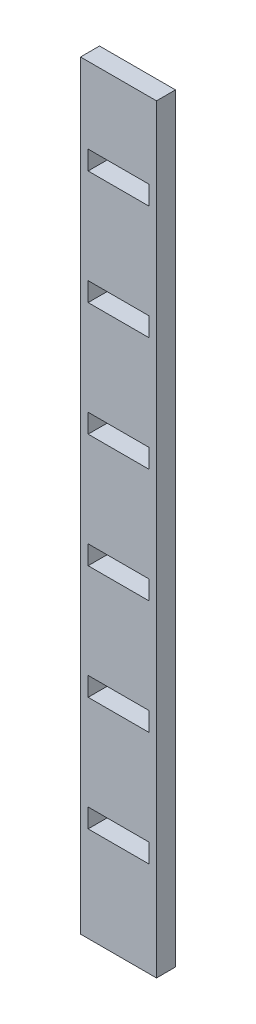
ISO-10303-21;
HEADER;
FILE_DESCRIPTION(('STEP AP214'),'2;1');
FILE_NAME('part.step','',(''),(''),'','','');
FILE_SCHEMA(('AUTOMOTIVE_DESIGN { 1 0 10303 214 1 1 1 1 }'));
ENDSEC;
DATA;
#1=APPLICATION_CONTEXT('core data for automotive mechanical design processes');
#2=APPLICATION_PROTOCOL_DEFINITION('international standard','automotive_design',2000,#1);
#3=PRODUCT_CONTEXT('',#1,'mechanical');
#4=PRODUCT('Part','Part','',(#3));
#5=PRODUCT_RELATED_PRODUCT_CATEGORY('part','',(#4));
#6=PRODUCT_DEFINITION_FORMATION('','',#4);
#7=PRODUCT_DEFINITION_CONTEXT('part definition',#1,'design');
#8=PRODUCT_DEFINITION('design','',#6,#7);
#9=PRODUCT_DEFINITION_SHAPE('','',#8);
#10=(LENGTH_UNIT() NAMED_UNIT(*) SI_UNIT(.MILLI.,.METRE.));
#11=(NAMED_UNIT(*) PLANE_ANGLE_UNIT() SI_UNIT($,.RADIAN.));
#12=(NAMED_UNIT(*) SI_UNIT($,.STERADIAN.) SOLID_ANGLE_UNIT());
#13=UNCERTAINTY_MEASURE_WITH_UNIT(LENGTH_MEASURE(1.E-05),#10,'distance_accuracy_value','');
#14=(GEOMETRIC_REPRESENTATION_CONTEXT(3) GLOBAL_UNCERTAINTY_ASSIGNED_CONTEXT((#13)) GLOBAL_UNIT_ASSIGNED_CONTEXT((#10,
#11,#12)) REPRESENTATION_CONTEXT('',''));
#15=CARTESIAN_POINT('',(0.,0.,0.));
#16=DIRECTION('',(0.,0.,1.));
#17=DIRECTION('',(1.,0.,0.));
#18=AXIS2_PLACEMENT_3D('',#15,#16,#17);
#19=CARTESIAN_POINT('',(0.,0.,50.));
#20=DIRECTION('',(0.,0.,-1.));
#21=DIRECTION('',(-1.,0.,0.));
#22=AXIS2_PLACEMENT_3D('',#19,#20,#21);
#23=PLANE('',#22);
#24=DIRECTION('',(0.,-1.,0.));
#25=VECTOR('',#24,1.);
#26=CARTESIAN_POINT('',(-80.,1450.,50.));
#27=LINE('',#26,#25);
#28=CARTESIAN_POINT('',(-80.,1500.,50.));
#29=VERTEX_POINT('',#28);
#30=CARTESIAN_POINT('',(-80.,1450.,50.));
#31=VERTEX_POINT('',#30);
#32=EDGE_CURVE('E262',#29,#31,#27,.T.);
#33=ORIENTED_EDGE('',*,*,#32,.F.);
#34=DIRECTION('',(-1.,0.,0.));
#35=VECTOR('',#34,1.);
#36=CARTESIAN_POINT('',(-80.,1500.,50.));
#37=LINE('',#36,#35);
#38=CARTESIAN_POINT('',(80.,1500.,50.));
#39=VERTEX_POINT('',#38);
#40=EDGE_CURVE('E270',#39,#29,#37,.T.);
#41=ORIENTED_EDGE('',*,*,#40,.F.);
#42=DIRECTION('',(0.,1.,0.));
#43=VECTOR('',#42,1.);
#44=CARTESIAN_POINT('',(80.,1500.,50.));
#45=LINE('',#44,#43);
#46=CARTESIAN_POINT('',(80.,1450.,50.));
#47=VERTEX_POINT('',#46);
#48=EDGE_CURVE('E267',#47,#39,#45,.T.);
#49=ORIENTED_EDGE('',*,*,#48,.F.);
#50=DIRECTION('',(1.,0.,0.));
#51=VECTOR('',#50,1.);
#52=CARTESIAN_POINT('',(80.,1450.,50.));
#53=LINE('',#52,#51);
#54=EDGE_CURVE('E264',#31,#47,#53,.T.);
#55=ORIENTED_EDGE('',*,*,#54,.F.);
#56=EDGE_LOOP('',(#33,#41,#49,#55));
#57=FACE_BOUND('',#56,.T.);
#58=DIRECTION('',(0.,-1.,0.));
#59=VECTOR('',#58,1.);
#60=CARTESIAN_POINT('',(-80.,850.,50.));
#61=LINE('',#60,#59);
#62=CARTESIAN_POINT('',(-80.,900.,50.));
#63=VERTEX_POINT('',#62);
#64=CARTESIAN_POINT('',(-80.,850.,50.));
#65=VERTEX_POINT('',#64);
#66=EDGE_CURVE('E324',#63,#65,#61,.T.);
#67=ORIENTED_EDGE('',*,*,#66,.F.);
#68=DIRECTION('',(-1.,0.,0.));
#69=VECTOR('',#68,1.);
#70=CARTESIAN_POINT('',(-80.,900.,50.));
#71=LINE('',#70,#69);
#72=CARTESIAN_POINT('',(80.,900.,50.));
#73=VERTEX_POINT('',#72);
#74=EDGE_CURVE('E332',#73,#63,#71,.T.);
#75=ORIENTED_EDGE('',*,*,#74,.F.);
#76=DIRECTION('',(0.,1.,0.));
#77=VECTOR('',#76,1.);
#78=CARTESIAN_POINT('',(80.,900.,50.));
#79=LINE('',#78,#77);
#80=CARTESIAN_POINT('',(80.,850.,50.));
#81=VERTEX_POINT('',#80);
#82=EDGE_CURVE('E329',#81,#73,#79,.T.);
#83=ORIENTED_EDGE('',*,*,#82,.F.);
#84=DIRECTION('',(1.,0.,0.));
#85=VECTOR('',#84,1.);
#86=CARTESIAN_POINT('',(80.,850.,50.));
#87=LINE('',#86,#85);
#88=EDGE_CURVE('E326',#65,#81,#87,.T.);
#89=ORIENTED_EDGE('',*,*,#88,.F.);
#90=EDGE_LOOP('',(#67,#75,#83,#89));
#91=FACE_BOUND('',#90,.T.);
#92=DIRECTION('',(0.,-1.,0.));
#93=VECTOR('',#92,1.);
#94=CARTESIAN_POINT('',(-80.,250.,50.));
#95=LINE('',#94,#93);
#96=CARTESIAN_POINT('',(-80.,300.,50.));
#97=VERTEX_POINT('',#96);
#98=CARTESIAN_POINT('',(-80.,250.,50.));
#99=VERTEX_POINT('',#98);
#100=EDGE_CURVE('E386',#97,#99,#95,.T.);
#101=ORIENTED_EDGE('',*,*,#100,.F.);
#102=DIRECTION('',(-1.,0.,0.));
#103=VECTOR('',#102,1.);
#104=CARTESIAN_POINT('',(-80.,300.,50.));
#105=LINE('',#104,#103);
#106=CARTESIAN_POINT('',(80.,300.,50.));
#107=VERTEX_POINT('',#106);
#108=EDGE_CURVE('E394',#107,#97,#105,.T.);
#109=ORIENTED_EDGE('',*,*,#108,.F.);
#110=DIRECTION('',(0.,1.,0.));
#111=VECTOR('',#110,1.);
#112=CARTESIAN_POINT('',(80.,300.,50.));
#113=LINE('',#112,#111);
#114=CARTESIAN_POINT('',(80.,250.,50.));
#115=VERTEX_POINT('',#114);
#116=EDGE_CURVE('E391',#115,#107,#113,.T.);
#117=ORIENTED_EDGE('',*,*,#116,.F.);
#118=DIRECTION('',(1.,0.,0.));
#119=VECTOR('',#118,1.);
#120=CARTESIAN_POINT('',(80.,250.,50.));
#121=LINE('',#120,#119);
#122=EDGE_CURVE('E388',#99,#115,#121,.T.);
#123=ORIENTED_EDGE('',*,*,#122,.F.);
#124=EDGE_LOOP('',(#101,#109,#117,#123));
#125=FACE_BOUND('',#124,.T.);
#126=DIRECTION('',(1.,0.,0.));
#127=VECTOR('',#126,1.);
#128=CARTESIAN_POINT('',(100.,0.,50.));
#129=LINE('',#128,#127);
#130=CARTESIAN_POINT('',(-100.,0.,50.));
#131=VERTEX_POINT('',#130);
#132=CARTESIAN_POINT('',(100.,0.,50.));
#133=VERTEX_POINT('',#132);
#134=EDGE_CURVE('E417',#131,#133,#129,.T.);
#135=ORIENTED_EDGE('',*,*,#134,.T.);
#136=DIRECTION('',(0.,1.,0.));
#137=VECTOR('',#136,1.);
#138=CARTESIAN_POINT('',(100.,2000.,50.));
#139=LINE('',#138,#137);
#140=CARTESIAN_POINT('',(100.,2000.,50.));
#141=VERTEX_POINT('',#140);
#142=EDGE_CURVE('E420',#133,#141,#139,.T.);
#143=ORIENTED_EDGE('',*,*,#142,.T.);
#144=DIRECTION('',(-1.,0.,0.));
#145=VECTOR('',#144,1.);
#146=CARTESIAN_POINT('',(-100.,2000.,50.));
#147=LINE('',#146,#145);
#148=CARTESIAN_POINT('',(-100.,2000.,50.));
#149=VERTEX_POINT('',#148);
#150=EDGE_CURVE('E423',#141,#149,#147,.T.);
#151=ORIENTED_EDGE('',*,*,#150,.T.);
#152=DIRECTION('',(0.,-1.,0.));
#153=VECTOR('',#152,1.);
#154=CARTESIAN_POINT('',(-100.,0.,50.));
#155=LINE('',#154,#153);
#156=EDGE_CURVE('E425',#149,#131,#155,.T.);
#157=ORIENTED_EDGE('',*,*,#156,.T.);
#158=EDGE_LOOP('',(#135,#143,#151,#157));
#159=FACE_BOUND('',#158,.T.);
#160=DIRECTION('',(0.,-1.,0.));
#161=VECTOR('',#160,1.);
#162=CARTESIAN_POINT('',(-80.,550.,50.));
#163=LINE('',#162,#161);
#164=CARTESIAN_POINT('',(-80.,600.,50.));
#165=VERTEX_POINT('',#164);
#166=CARTESIAN_POINT('',(-80.,550.,50.));
#167=VERTEX_POINT('',#166);
#168=EDGE_CURVE('E355',#165,#167,#163,.T.);
#169=ORIENTED_EDGE('',*,*,#168,.F.);
#170=DIRECTION('',(-1.,0.,0.));
#171=VECTOR('',#170,1.);
#172=CARTESIAN_POINT('',(-80.,600.,50.));
#173=LINE('',#172,#171);
#174=CARTESIAN_POINT('',(80.,600.,50.));
#175=VERTEX_POINT('',#174);
#176=EDGE_CURVE('E363',#175,#165,#173,.T.);
#177=ORIENTED_EDGE('',*,*,#176,.F.);
#178=DIRECTION('',(0.,1.,0.));
#179=VECTOR('',#178,1.);
#180=CARTESIAN_POINT('',(80.,600.,50.));
#181=LINE('',#180,#179);
#182=CARTESIAN_POINT('',(80.,550.,50.));
#183=VERTEX_POINT('',#182);
#184=EDGE_CURVE('E360',#183,#175,#181,.T.);
#185=ORIENTED_EDGE('',*,*,#184,.F.);
#186=DIRECTION('',(1.,0.,0.));
#187=VECTOR('',#186,1.);
#188=CARTESIAN_POINT('',(80.,550.,50.));
#189=LINE('',#188,#187);
#190=EDGE_CURVE('E357',#167,#183,#189,.T.);
#191=ORIENTED_EDGE('',*,*,#190,.F.);
#192=EDGE_LOOP('',(#169,#177,#185,#191));
#193=FACE_BOUND('',#192,.T.);
#194=DIRECTION('',(0.,-1.,0.));
#195=VECTOR('',#194,1.);
#196=CARTESIAN_POINT('',(-80.,1150.,50.));
#197=LINE('',#196,#195);
#198=CARTESIAN_POINT('',(-80.,1200.,50.));
#199=VERTEX_POINT('',#198);
#200=CARTESIAN_POINT('',(-80.,1150.,50.));
#201=VERTEX_POINT('',#200);
#202=EDGE_CURVE('E293',#199,#201,#197,.T.);
#203=ORIENTED_EDGE('',*,*,#202,.F.);
#204=DIRECTION('',(-1.,0.,0.));
#205=VECTOR('',#204,1.);
#206=CARTESIAN_POINT('',(-80.,1200.,50.));
#207=LINE('',#206,#205);
#208=CARTESIAN_POINT('',(80.,1200.,50.));
#209=VERTEX_POINT('',#208);
#210=EDGE_CURVE('E301',#209,#199,#207,.T.);
#211=ORIENTED_EDGE('',*,*,#210,.F.);
#212=DIRECTION('',(0.,1.,0.));
#213=VECTOR('',#212,1.);
#214=CARTESIAN_POINT('',(80.,1200.,50.));
#215=LINE('',#214,#213);
#216=CARTESIAN_POINT('',(80.,1150.,50.));
#217=VERTEX_POINT('',#216);
#218=EDGE_CURVE('E298',#217,#209,#215,.T.);
#219=ORIENTED_EDGE('',*,*,#218,.F.);
#220=DIRECTION('',(1.,0.,0.));
#221=VECTOR('',#220,1.);
#222=CARTESIAN_POINT('',(80.,1150.,50.));
#223=LINE('',#222,#221);
#224=EDGE_CURVE('E295',#201,#217,#223,.T.);
#225=ORIENTED_EDGE('',*,*,#224,.F.);
#226=EDGE_LOOP('',(#203,#211,#219,#225));
#227=FACE_BOUND('',#226,.T.);
#228=DIRECTION('',(0.,-1.,0.));
#229=VECTOR('',#228,1.);
#230=CARTESIAN_POINT('',(-80.,1750.,50.));
#231=LINE('',#230,#229);
#232=CARTESIAN_POINT('',(-80.,1800.,50.));
#233=VERTEX_POINT('',#232);
#234=CARTESIAN_POINT('',(-80.,1750.,50.));
#235=VERTEX_POINT('',#234);
#236=EDGE_CURVE('E226',#233,#235,#231,.T.);
#237=ORIENTED_EDGE('',*,*,#236,.F.);
#238=DIRECTION('',(-1.,0.,0.));
#239=VECTOR('',#238,1.);
#240=CARTESIAN_POINT('',(-80.,1800.,50.));
#241=LINE('',#240,#239);
#242=CARTESIAN_POINT('',(80.,1800.,50.));
#243=VERTEX_POINT('',#242);
#244=EDGE_CURVE('E248',#243,#233,#241,.T.);
#245=ORIENTED_EDGE('',*,*,#244,.F.);
#246=DIRECTION('',(0.,1.,0.));
#247=VECTOR('',#246,1.);
#248=CARTESIAN_POINT('',(80.,1800.,50.));
#249=LINE('',#248,#247);
#250=CARTESIAN_POINT('',(80.,1750.,50.));
#251=VERTEX_POINT('',#250);
#252=EDGE_CURVE('E246',#251,#243,#249,.T.);
#253=ORIENTED_EDGE('',*,*,#252,.F.);
#254=DIRECTION('',(1.,0.,0.));
#255=VECTOR('',#254,1.);
#256=CARTESIAN_POINT('',(80.,1750.,50.));
#257=LINE('',#256,#255);
#258=EDGE_CURVE('E234',#235,#251,#257,.T.);
#259=ORIENTED_EDGE('',*,*,#258,.F.);
#260=EDGE_LOOP('',(#237,#245,#253,#259));
#261=FACE_BOUND('',#260,.T.);
#262=ADVANCED_FACE('F41',(#57,#91,#125,#159,#193,#227,#261),#23,.F.);
#263=CARTESIAN_POINT('',(0.,0.,0.));
#264=DIRECTION('',(0.,0.,-1.));
#265=DIRECTION('',(-1.,0.,0.));
#266=AXIS2_PLACEMENT_3D('',#263,#264,#265);
#267=PLANE('',#266);
#268=DIRECTION('',(1.,0.,0.));
#269=VECTOR('',#268,1.);
#270=CARTESIAN_POINT('',(100.,0.,0.));
#271=LINE('',#270,#269);
#272=CARTESIAN_POINT('',(-100.,0.,0.));
#273=VERTEX_POINT('',#272);
#274=CARTESIAN_POINT('',(100.,0.,0.));
#275=VERTEX_POINT('',#274);
#276=EDGE_CURVE('E416',#273,#275,#271,.T.);
#277=ORIENTED_EDGE('',*,*,#276,.F.);
#278=DIRECTION('',(0.,-1.,0.));
#279=VECTOR('',#278,1.);
#280=CARTESIAN_POINT('',(-100.,0.,0.));
#281=LINE('',#280,#279);
#282=CARTESIAN_POINT('',(-100.,2000.,0.));
#283=VERTEX_POINT('',#282);
#284=EDGE_CURVE('E421',#283,#273,#281,.T.);
#285=ORIENTED_EDGE('',*,*,#284,.F.);
#286=DIRECTION('',(-1.,0.,0.));
#287=VECTOR('',#286,1.);
#288=CARTESIAN_POINT('',(-100.,2000.,0.));
#289=LINE('',#288,#287);
#290=CARTESIAN_POINT('',(100.,2000.,0.));
#291=VERTEX_POINT('',#290);
#292=EDGE_CURVE('E432',#291,#283,#289,.T.);
#293=ORIENTED_EDGE('',*,*,#292,.F.);
#294=DIRECTION('',(0.,1.,0.));
#295=VECTOR('',#294,1.);
#296=CARTESIAN_POINT('',(100.,2000.,0.));
#297=LINE('',#296,#295);
#298=EDGE_CURVE('E430',#275,#291,#297,.T.);
#299=ORIENTED_EDGE('',*,*,#298,.F.);
#300=EDGE_LOOP('',(#277,#285,#293,#299));
#301=FACE_BOUND('',#300,.T.);
#302=DIRECTION('',(-1.,0.,0.));
#303=VECTOR('',#302,1.);
#304=CARTESIAN_POINT('',(-80.,300.,0.));
#305=LINE('',#304,#303);
#306=CARTESIAN_POINT('',(80.,300.,0.));
#307=VERTEX_POINT('',#306);
#308=CARTESIAN_POINT('',(-80.,300.,0.));
#309=VERTEX_POINT('',#308);
#310=EDGE_CURVE('E389',#307,#309,#305,.T.);
#311=ORIENTED_EDGE('',*,*,#310,.T.);
#312=DIRECTION('',(0.,-1.,0.));
#313=VECTOR('',#312,1.);
#314=CARTESIAN_POINT('',(-80.,250.,0.));
#315=LINE('',#314,#313);
#316=CARTESIAN_POINT('',(-80.,250.,0.));
#317=VERTEX_POINT('',#316);
#318=EDGE_CURVE('E385',#309,#317,#315,.T.);
#319=ORIENTED_EDGE('',*,*,#318,.T.);
#320=DIRECTION('',(1.,0.,0.));
#321=VECTOR('',#320,1.);
#322=CARTESIAN_POINT('',(80.,250.,0.));
#323=LINE('',#322,#321);
#324=CARTESIAN_POINT('',(80.,250.,0.));
#325=VERTEX_POINT('',#324);
#326=EDGE_CURVE('E399',#317,#325,#323,.T.);
#327=ORIENTED_EDGE('',*,*,#326,.T.);
#328=DIRECTION('',(0.,1.,0.));
#329=VECTOR('',#328,1.);
#330=CARTESIAN_POINT('',(80.,300.,0.));
#331=LINE('',#330,#329);
#332=EDGE_CURVE('E402',#325,#307,#331,.T.);
#333=ORIENTED_EDGE('',*,*,#332,.T.);
#334=EDGE_LOOP('',(#311,#319,#327,#333));
#335=FACE_BOUND('',#334,.T.);
#336=DIRECTION('',(-1.,0.,0.));
#337=VECTOR('',#336,1.);
#338=CARTESIAN_POINT('',(-80.,600.,0.));
#339=LINE('',#338,#337);
#340=CARTESIAN_POINT('',(80.,600.,0.));
#341=VERTEX_POINT('',#340);
#342=CARTESIAN_POINT('',(-80.,600.,0.));
#343=VERTEX_POINT('',#342);
#344=EDGE_CURVE('E358',#341,#343,#339,.T.);
#345=ORIENTED_EDGE('',*,*,#344,.T.);
#346=DIRECTION('',(0.,-1.,0.));
#347=VECTOR('',#346,1.);
#348=CARTESIAN_POINT('',(-80.,550.,0.));
#349=LINE('',#348,#347);
#350=CARTESIAN_POINT('',(-80.,550.,0.));
#351=VERTEX_POINT('',#350);
#352=EDGE_CURVE('E354',#343,#351,#349,.T.);
#353=ORIENTED_EDGE('',*,*,#352,.T.);
#354=DIRECTION('',(1.,0.,0.));
#355=VECTOR('',#354,1.);
#356=CARTESIAN_POINT('',(80.,550.,0.));
#357=LINE('',#356,#355);
#358=CARTESIAN_POINT('',(80.,550.,0.));
#359=VERTEX_POINT('',#358);
#360=EDGE_CURVE('E368',#351,#359,#357,.T.);
#361=ORIENTED_EDGE('',*,*,#360,.T.);
#362=DIRECTION('',(0.,1.,0.));
#363=VECTOR('',#362,1.);
#364=CARTESIAN_POINT('',(80.,600.,0.));
#365=LINE('',#364,#363);
#366=EDGE_CURVE('E371',#359,#341,#365,.T.);
#367=ORIENTED_EDGE('',*,*,#366,.T.);
#368=EDGE_LOOP('',(#345,#353,#361,#367));
#369=FACE_BOUND('',#368,.T.);
#370=DIRECTION('',(-1.,0.,0.));
#371=VECTOR('',#370,1.);
#372=CARTESIAN_POINT('',(-80.,900.,0.));
#373=LINE('',#372,#371);
#374=CARTESIAN_POINT('',(80.,900.,0.));
#375=VERTEX_POINT('',#374);
#376=CARTESIAN_POINT('',(-80.,900.,0.));
#377=VERTEX_POINT('',#376);
#378=EDGE_CURVE('E327',#375,#377,#373,.T.);
#379=ORIENTED_EDGE('',*,*,#378,.T.);
#380=DIRECTION('',(0.,-1.,0.));
#381=VECTOR('',#380,1.);
#382=CARTESIAN_POINT('',(-80.,850.,0.));
#383=LINE('',#382,#381);
#384=CARTESIAN_POINT('',(-80.,850.,0.));
#385=VERTEX_POINT('',#384);
#386=EDGE_CURVE('E323',#377,#385,#383,.T.);
#387=ORIENTED_EDGE('',*,*,#386,.T.);
#388=DIRECTION('',(1.,0.,0.));
#389=VECTOR('',#388,1.);
#390=CARTESIAN_POINT('',(80.,850.,0.));
#391=LINE('',#390,#389);
#392=CARTESIAN_POINT('',(80.,850.,0.));
#393=VERTEX_POINT('',#392);
#394=EDGE_CURVE('E337',#385,#393,#391,.T.);
#395=ORIENTED_EDGE('',*,*,#394,.T.);
#396=DIRECTION('',(0.,1.,0.));
#397=VECTOR('',#396,1.);
#398=CARTESIAN_POINT('',(80.,900.,0.));
#399=LINE('',#398,#397);
#400=EDGE_CURVE('E340',#393,#375,#399,.T.);
#401=ORIENTED_EDGE('',*,*,#400,.T.);
#402=EDGE_LOOP('',(#379,#387,#395,#401));
#403=FACE_BOUND('',#402,.T.);
#404=DIRECTION('',(-1.,0.,0.));
#405=VECTOR('',#404,1.);
#406=CARTESIAN_POINT('',(-80.,1200.,0.));
#407=LINE('',#406,#405);
#408=CARTESIAN_POINT('',(80.,1200.,0.));
#409=VERTEX_POINT('',#408);
#410=CARTESIAN_POINT('',(-80.,1200.,0.));
#411=VERTEX_POINT('',#410);
#412=EDGE_CURVE('E296',#409,#411,#407,.T.);
#413=ORIENTED_EDGE('',*,*,#412,.T.);
#414=DIRECTION('',(0.,-1.,0.));
#415=VECTOR('',#414,1.);
#416=CARTESIAN_POINT('',(-80.,1150.,0.));
#417=LINE('',#416,#415);
#418=CARTESIAN_POINT('',(-80.,1150.,0.));
#419=VERTEX_POINT('',#418);
#420=EDGE_CURVE('E292',#411,#419,#417,.T.);
#421=ORIENTED_EDGE('',*,*,#420,.T.);
#422=DIRECTION('',(1.,0.,0.));
#423=VECTOR('',#422,1.);
#424=CARTESIAN_POINT('',(80.,1150.,0.));
#425=LINE('',#424,#423);
#426=CARTESIAN_POINT('',(80.,1150.,0.));
#427=VERTEX_POINT('',#426);
#428=EDGE_CURVE('E306',#419,#427,#425,.T.);
#429=ORIENTED_EDGE('',*,*,#428,.T.);
#430=DIRECTION('',(0.,1.,0.));
#431=VECTOR('',#430,1.);
#432=CARTESIAN_POINT('',(80.,1200.,0.));
#433=LINE('',#432,#431);
#434=EDGE_CURVE('E309',#427,#409,#433,.T.);
#435=ORIENTED_EDGE('',*,*,#434,.T.);
#436=EDGE_LOOP('',(#413,#421,#429,#435));
#437=FACE_BOUND('',#436,.T.);
#438=DIRECTION('',(-1.,0.,0.));
#439=VECTOR('',#438,1.);
#440=CARTESIAN_POINT('',(-80.,1500.,0.));
#441=LINE('',#440,#439);
#442=CARTESIAN_POINT('',(80.,1500.,0.));
#443=VERTEX_POINT('',#442);
#444=CARTESIAN_POINT('',(-80.,1500.,0.));
#445=VERTEX_POINT('',#444);
#446=EDGE_CURVE('E265',#443,#445,#441,.T.);
#447=ORIENTED_EDGE('',*,*,#446,.T.);
#448=DIRECTION('',(0.,-1.,0.));
#449=VECTOR('',#448,1.);
#450=CARTESIAN_POINT('',(-80.,1450.,0.));
#451=LINE('',#450,#449);
#452=CARTESIAN_POINT('',(-80.,1450.,0.));
#453=VERTEX_POINT('',#452);
#454=EDGE_CURVE('E242',#445,#453,#451,.T.);
#455=ORIENTED_EDGE('',*,*,#454,.T.);
#456=DIRECTION('',(1.,0.,0.));
#457=VECTOR('',#456,1.);
#458=CARTESIAN_POINT('',(80.,1450.,0.));
#459=LINE('',#458,#457);
#460=CARTESIAN_POINT('',(80.,1450.,0.));
#461=VERTEX_POINT('',#460);
#462=EDGE_CURVE('E275',#453,#461,#459,.T.);
#463=ORIENTED_EDGE('',*,*,#462,.T.);
#464=DIRECTION('',(0.,1.,0.));
#465=VECTOR('',#464,1.);
#466=CARTESIAN_POINT('',(80.,1500.,0.));
#467=LINE('',#466,#465);
#468=EDGE_CURVE('E278',#461,#443,#467,.T.);
#469=ORIENTED_EDGE('',*,*,#468,.T.);
#470=EDGE_LOOP('',(#447,#455,#463,#469));
#471=FACE_BOUND('',#470,.T.);
#472=DIRECTION('',(-1.,0.,0.));
#473=VECTOR('',#472,1.);
#474=CARTESIAN_POINT('',(-80.,1800.,0.));
#475=LINE('',#474,#473);
#476=CARTESIAN_POINT('',(80.,1800.,0.));
#477=VERTEX_POINT('',#476);
#478=CARTESIAN_POINT('',(-80.,1800.,0.));
#479=VERTEX_POINT('',#478);
#480=EDGE_CURVE('E235',#477,#479,#475,.T.);
#481=ORIENTED_EDGE('',*,*,#480,.T.);
#482=DIRECTION('',(0.,-1.,0.));
#483=VECTOR('',#482,1.);
#484=CARTESIAN_POINT('',(-80.,1750.,0.));
#485=LINE('',#484,#483);
#486=CARTESIAN_POINT('',(-80.,1750.,0.));
#487=VERTEX_POINT('',#486);
#488=EDGE_CURVE('E64',#479,#487,#485,.T.);
#489=ORIENTED_EDGE('',*,*,#488,.T.);
#490=DIRECTION('',(1.,0.,0.));
#491=VECTOR('',#490,1.);
#492=CARTESIAN_POINT('',(80.,1750.,0.));
#493=LINE('',#492,#491);
#494=CARTESIAN_POINT('',(80.,1750.,0.));
#495=VERTEX_POINT('',#494);
#496=EDGE_CURVE('E241',#487,#495,#493,.T.);
#497=ORIENTED_EDGE('',*,*,#496,.T.);
#498=DIRECTION('',(0.,1.,0.));
#499=VECTOR('',#498,1.);
#500=CARTESIAN_POINT('',(80.,1800.,0.));
#501=LINE('',#500,#499);
#502=EDGE_CURVE('E254',#495,#477,#501,.T.);
#503=ORIENTED_EDGE('',*,*,#502,.T.);
#504=EDGE_LOOP('',(#481,#489,#497,#503));
#505=FACE_BOUND('',#504,.T.);
#506=ADVANCED_FACE('F450',(#301,#335,#369,#403,#437,#471,#505),#267,.T.);
#507=CARTESIAN_POINT('',(100.,0.,50.));
#508=DIRECTION('',(0.,1.,0.));
#509=DIRECTION('',(0.,0.,1.));
#510=AXIS2_PLACEMENT_3D('',#507,#508,#509);
#511=PLANE('',#510);
#512=ORIENTED_EDGE('',*,*,#276,.T.);
#513=DIRECTION('',(0.,0.,-1.));
#514=VECTOR('',#513,1.);
#515=CARTESIAN_POINT('',(100.,0.,50.));
#516=LINE('',#515,#514);
#517=EDGE_CURVE('E11',#133,#275,#516,.T.);
#518=ORIENTED_EDGE('',*,*,#517,.F.);
#519=ORIENTED_EDGE('',*,*,#134,.F.);
#520=DIRECTION('',(0.,0.,-1.));
#521=VECTOR('',#520,1.);
#522=CARTESIAN_POINT('',(-100.,0.,50.));
#523=LINE('',#522,#521);
#524=EDGE_CURVE('E427',#131,#273,#523,.T.);
#525=ORIENTED_EDGE('',*,*,#524,.T.);
#526=EDGE_LOOP('',(#512,#518,#519,#525));
#527=FACE_BOUND('',#526,.T.);
#528=ADVANCED_FACE('F43',(#527),#511,.F.);
#529=CARTESIAN_POINT('',(100.,2000.,50.));
#530=DIRECTION('',(-1.,0.,0.));
#531=DIRECTION('',(0.,0.,1.));
#532=AXIS2_PLACEMENT_3D('',#529,#530,#531);
#533=PLANE('',#532);
#534=ORIENTED_EDGE('',*,*,#298,.T.);
#535=DIRECTION('',(0.,0.,-1.));
#536=VECTOR('',#535,1.);
#537=CARTESIAN_POINT('',(100.,2000.,50.));
#538=LINE('',#537,#536);
#539=EDGE_CURVE('E49',#141,#291,#538,.T.);
#540=ORIENTED_EDGE('',*,*,#539,.F.);
#541=ORIENTED_EDGE('',*,*,#142,.F.);
#542=ORIENTED_EDGE('',*,*,#517,.T.);
#543=EDGE_LOOP('',(#534,#540,#541,#542));
#544=FACE_BOUND('',#543,.T.);
#545=ADVANCED_FACE('F461',(#544),#533,.F.);
#546=CARTESIAN_POINT('',(-100.,2000.,50.));
#547=DIRECTION('',(0.,-1.,0.));
#548=DIRECTION('',(0.,0.,-1.));
#549=AXIS2_PLACEMENT_3D('',#546,#547,#548);
#550=PLANE('',#549);
#551=ORIENTED_EDGE('',*,*,#292,.T.);
#552=DIRECTION('',(0.,0.,-1.));
#553=VECTOR('',#552,1.);
#554=CARTESIAN_POINT('',(-100.,2000.,50.));
#555=LINE('',#554,#553);
#556=EDGE_CURVE('E437',#149,#283,#555,.T.);
#557=ORIENTED_EDGE('',*,*,#556,.F.);
#558=ORIENTED_EDGE('',*,*,#150,.F.);
#559=ORIENTED_EDGE('',*,*,#539,.T.);
#560=EDGE_LOOP('',(#551,#557,#558,#559));
#561=FACE_BOUND('',#560,.T.);
#562=ADVANCED_FACE('F444',(#561),#550,.F.);
#563=CARTESIAN_POINT('',(-100.,0.,50.));
#564=DIRECTION('',(1.,0.,0.));
#565=DIRECTION('',(0.,0.,-1.));
#566=AXIS2_PLACEMENT_3D('',#563,#564,#565);
#567=PLANE('',#566);
#568=ORIENTED_EDGE('',*,*,#284,.T.);
#569=ORIENTED_EDGE('',*,*,#524,.F.);
#570=ORIENTED_EDGE('',*,*,#156,.F.);
#571=ORIENTED_EDGE('',*,*,#556,.T.);
#572=EDGE_LOOP('',(#568,#569,#570,#571));
#573=FACE_BOUND('',#572,.T.);
#574=ADVANCED_FACE('F454',(#573),#567,.F.);
#575=CARTESIAN_POINT('',(-80.,250.,50.));
#576=DIRECTION('',(1.,0.,0.));
#577=DIRECTION('',(0.,0.,-1.));
#578=AXIS2_PLACEMENT_3D('',#575,#576,#577);
#579=PLANE('',#578);
#580=ORIENTED_EDGE('',*,*,#318,.F.);
#581=DIRECTION('',(0.,0.,-1.));
#582=VECTOR('',#581,1.);
#583=CARTESIAN_POINT('',(-80.,300.,50.));
#584=LINE('',#583,#582);
#585=EDGE_CURVE('E396',#97,#309,#584,.T.);
#586=ORIENTED_EDGE('',*,*,#585,.F.);
#587=ORIENTED_EDGE('',*,*,#100,.T.);
#588=DIRECTION('',(0.,0.,-1.));
#589=VECTOR('',#588,1.);
#590=CARTESIAN_POINT('',(-80.,250.,50.));
#591=LINE('',#590,#589);
#592=EDGE_CURVE('E413',#99,#317,#591,.T.);
#593=ORIENTED_EDGE('',*,*,#592,.T.);
#594=EDGE_LOOP('',(#580,#586,#587,#593));
#595=FACE_BOUND('',#594,.T.);
#596=ADVANCED_FACE('F478',(#595),#579,.T.);
#597=CARTESIAN_POINT('',(80.,250.,50.));
#598=DIRECTION('',(0.,1.,0.));
#599=DIRECTION('',(0.,0.,1.));
#600=AXIS2_PLACEMENT_3D('',#597,#598,#599);
#601=PLANE('',#600);
#602=ORIENTED_EDGE('',*,*,#326,.F.);
#603=ORIENTED_EDGE('',*,*,#592,.F.);
#604=ORIENTED_EDGE('',*,*,#122,.T.);
#605=DIRECTION('',(0.,0.,-1.));
#606=VECTOR('',#605,1.);
#607=CARTESIAN_POINT('',(80.,250.,50.));
#608=LINE('',#607,#606);
#609=EDGE_CURVE('E411',#115,#325,#608,.T.);
#610=ORIENTED_EDGE('',*,*,#609,.T.);
#611=EDGE_LOOP('',(#602,#603,#604,#610));
#612=FACE_BOUND('',#611,.T.);
#613=ADVANCED_FACE('F485',(#612),#601,.T.);
#614=CARTESIAN_POINT('',(80.,300.,50.));
#615=DIRECTION('',(-1.,0.,0.));
#616=DIRECTION('',(0.,0.,1.));
#617=AXIS2_PLACEMENT_3D('',#614,#615,#616);
#618=PLANE('',#617);
#619=ORIENTED_EDGE('',*,*,#332,.F.);
#620=ORIENTED_EDGE('',*,*,#609,.F.);
#621=ORIENTED_EDGE('',*,*,#116,.T.);
#622=DIRECTION('',(0.,0.,-1.));
#623=VECTOR('',#622,1.);
#624=CARTESIAN_POINT('',(80.,300.,50.));
#625=LINE('',#624,#623);
#626=EDGE_CURVE('E409',#107,#307,#625,.T.);
#627=ORIENTED_EDGE('',*,*,#626,.T.);
#628=EDGE_LOOP('',(#619,#620,#621,#627));
#629=FACE_BOUND('',#628,.T.);
#630=ADVANCED_FACE('F490',(#629),#618,.T.);
#631=CARTESIAN_POINT('',(-80.,300.,50.));
#632=DIRECTION('',(0.,-1.,0.));
#633=DIRECTION('',(0.,0.,-1.));
#634=AXIS2_PLACEMENT_3D('',#631,#632,#633);
#635=PLANE('',#634);
#636=ORIENTED_EDGE('',*,*,#310,.F.);
#637=ORIENTED_EDGE('',*,*,#626,.F.);
#638=ORIENTED_EDGE('',*,*,#108,.T.);
#639=ORIENTED_EDGE('',*,*,#585,.T.);
#640=EDGE_LOOP('',(#636,#637,#638,#639));
#641=FACE_BOUND('',#640,.T.);
#642=ADVANCED_FACE('F497',(#641),#635,.T.);
#643=CARTESIAN_POINT('',(-80.,550.,50.));
#644=DIRECTION('',(1.,0.,0.));
#645=DIRECTION('',(0.,0.,-1.));
#646=AXIS2_PLACEMENT_3D('',#643,#644,#645);
#647=PLANE('',#646);
#648=ORIENTED_EDGE('',*,*,#352,.F.);
#649=DIRECTION('',(0.,0.,-1.));
#650=VECTOR('',#649,1.);
#651=CARTESIAN_POINT('',(-80.,600.,50.));
#652=LINE('',#651,#650);
#653=EDGE_CURVE('E365',#165,#343,#652,.T.);
#654=ORIENTED_EDGE('',*,*,#653,.F.);
#655=ORIENTED_EDGE('',*,*,#168,.T.);
#656=DIRECTION('',(0.,0.,-1.));
#657=VECTOR('',#656,1.);
#658=CARTESIAN_POINT('',(-80.,550.,50.));
#659=LINE('',#658,#657);
#660=EDGE_CURVE('E382',#167,#351,#659,.T.);
#661=ORIENTED_EDGE('',*,*,#660,.T.);
#662=EDGE_LOOP('',(#648,#654,#655,#661));
#663=FACE_BOUND('',#662,.T.);
#664=ADVANCED_FACE('F511',(#663),#647,.T.);
#665=CARTESIAN_POINT('',(80.,550.,50.));
#666=DIRECTION('',(0.,1.,0.));
#667=DIRECTION('',(-1.,0.,0.));
#668=AXIS2_PLACEMENT_3D('',#665,#666,#667);
#669=PLANE('',#668);
#670=ORIENTED_EDGE('',*,*,#360,.F.);
#671=ORIENTED_EDGE('',*,*,#660,.F.);
#672=ORIENTED_EDGE('',*,*,#190,.T.);
#673=DIRECTION('',(0.,0.,-1.));
#674=VECTOR('',#673,1.);
#675=CARTESIAN_POINT('',(80.,550.,50.));
#676=LINE('',#675,#674);
#677=EDGE_CURVE('E380',#183,#359,#676,.T.);
#678=ORIENTED_EDGE('',*,*,#677,.T.);
#679=EDGE_LOOP('',(#670,#671,#672,#678));
#680=FACE_BOUND('',#679,.T.);
#681=ADVANCED_FACE('F516',(#680),#669,.T.);
#682=CARTESIAN_POINT('',(80.,600.,50.));
#683=DIRECTION('',(-1.,0.,0.));
#684=DIRECTION('',(0.,0.,1.));
#685=AXIS2_PLACEMENT_3D('',#682,#683,#684);
#686=PLANE('',#685);
#687=ORIENTED_EDGE('',*,*,#366,.F.);
#688=ORIENTED_EDGE('',*,*,#677,.F.);
#689=ORIENTED_EDGE('',*,*,#184,.T.);
#690=DIRECTION('',(0.,0.,-1.));
#691=VECTOR('',#690,1.);
#692=CARTESIAN_POINT('',(80.,600.,50.));
#693=LINE('',#692,#691);
#694=EDGE_CURVE('E378',#175,#341,#693,.T.);
#695=ORIENTED_EDGE('',*,*,#694,.T.);
#696=EDGE_LOOP('',(#687,#688,#689,#695));
#697=FACE_BOUND('',#696,.T.);
#698=ADVANCED_FACE('F520',(#697),#686,.T.);
#699=CARTESIAN_POINT('',(-80.,600.,50.));
#700=DIRECTION('',(0.,-1.,0.));
#701=DIRECTION('',(0.,0.,-1.));
#702=AXIS2_PLACEMENT_3D('',#699,#700,#701);
#703=PLANE('',#702);
#704=ORIENTED_EDGE('',*,*,#344,.F.);
#705=ORIENTED_EDGE('',*,*,#694,.F.);
#706=ORIENTED_EDGE('',*,*,#176,.T.);
#707=ORIENTED_EDGE('',*,*,#653,.T.);
#708=EDGE_LOOP('',(#704,#705,#706,#707));
#709=FACE_BOUND('',#708,.T.);
#710=ADVANCED_FACE('F524',(#709),#703,.T.);
#711=CARTESIAN_POINT('',(-80.,850.,50.));
#712=DIRECTION('',(1.,0.,0.));
#713=DIRECTION('',(0.,0.,-1.));
#714=AXIS2_PLACEMENT_3D('',#711,#712,#713);
#715=PLANE('',#714);
#716=ORIENTED_EDGE('',*,*,#386,.F.);
#717=DIRECTION('',(0.,0.,-1.));
#718=VECTOR('',#717,1.);
#719=CARTESIAN_POINT('',(-80.,900.,50.));
#720=LINE('',#719,#718);
#721=EDGE_CURVE('E334',#63,#377,#720,.T.);
#722=ORIENTED_EDGE('',*,*,#721,.F.);
#723=ORIENTED_EDGE('',*,*,#66,.T.);
#724=DIRECTION('',(0.,0.,-1.));
#725=VECTOR('',#724,1.);
#726=CARTESIAN_POINT('',(-80.,850.,50.));
#727=LINE('',#726,#725);
#728=EDGE_CURVE('E351',#65,#385,#727,.T.);
#729=ORIENTED_EDGE('',*,*,#728,.T.);
#730=EDGE_LOOP('',(#716,#722,#723,#729));
#731=FACE_BOUND('',#730,.T.);
#732=ADVANCED_FACE('F528',(#731),#715,.T.);
#733=CARTESIAN_POINT('',(80.,850.,50.));
#734=DIRECTION('',(0.,1.,0.));
#735=DIRECTION('',(-1.,0.,0.));
#736=AXIS2_PLACEMENT_3D('',#733,#734,#735);
#737=PLANE('',#736);
#738=ORIENTED_EDGE('',*,*,#394,.F.);
#739=ORIENTED_EDGE('',*,*,#728,.F.);
#740=ORIENTED_EDGE('',*,*,#88,.T.);
#741=DIRECTION('',(0.,0.,-1.));
#742=VECTOR('',#741,1.);
#743=CARTESIAN_POINT('',(80.,850.,50.));
#744=LINE('',#743,#742);
#745=EDGE_CURVE('E349',#81,#393,#744,.T.);
#746=ORIENTED_EDGE('',*,*,#745,.T.);
#747=EDGE_LOOP('',(#738,#739,#740,#746));
#748=FACE_BOUND('',#747,.T.);
#749=ADVANCED_FACE('F532',(#748),#737,.T.);
#750=CARTESIAN_POINT('',(80.,900.,50.));
#751=DIRECTION('',(-1.,0.,0.));
#752=DIRECTION('',(0.,0.,1.));
#753=AXIS2_PLACEMENT_3D('',#750,#751,#752);
#754=PLANE('',#753);
#755=ORIENTED_EDGE('',*,*,#400,.F.);
#756=ORIENTED_EDGE('',*,*,#745,.F.);
#757=ORIENTED_EDGE('',*,*,#82,.T.);
#758=DIRECTION('',(0.,0.,-1.));
#759=VECTOR('',#758,1.);
#760=CARTESIAN_POINT('',(80.,900.,50.));
#761=LINE('',#760,#759);
#762=EDGE_CURVE('E347',#73,#375,#761,.T.);
#763=ORIENTED_EDGE('',*,*,#762,.T.);
#764=EDGE_LOOP('',(#755,#756,#757,#763));
#765=FACE_BOUND('',#764,.T.);
#766=ADVANCED_FACE('F536',(#765),#754,.T.);
#767=CARTESIAN_POINT('',(-80.,900.,50.));
#768=DIRECTION('',(0.,-1.,0.));
#769=DIRECTION('',(0.,0.,-1.));
#770=AXIS2_PLACEMENT_3D('',#767,#768,#769);
#771=PLANE('',#770);
#772=ORIENTED_EDGE('',*,*,#378,.F.);
#773=ORIENTED_EDGE('',*,*,#762,.F.);
#774=ORIENTED_EDGE('',*,*,#74,.T.);
#775=ORIENTED_EDGE('',*,*,#721,.T.);
#776=EDGE_LOOP('',(#772,#773,#774,#775));
#777=FACE_BOUND('',#776,.T.);
#778=ADVANCED_FACE('F540',(#777),#771,.T.);
#779=CARTESIAN_POINT('',(-80.,1150.,50.));
#780=DIRECTION('',(1.,0.,0.));
#781=DIRECTION('',(0.,0.,-1.));
#782=AXIS2_PLACEMENT_3D('',#779,#780,#781);
#783=PLANE('',#782);
#784=ORIENTED_EDGE('',*,*,#420,.F.);
#785=DIRECTION('',(0.,0.,-1.));
#786=VECTOR('',#785,1.);
#787=CARTESIAN_POINT('',(-80.,1200.,50.));
#788=LINE('',#787,#786);
#789=EDGE_CURVE('E303',#199,#411,#788,.T.);
#790=ORIENTED_EDGE('',*,*,#789,.F.);
#791=ORIENTED_EDGE('',*,*,#202,.T.);
#792=DIRECTION('',(0.,0.,-1.));
#793=VECTOR('',#792,1.);
#794=CARTESIAN_POINT('',(-80.,1150.,50.));
#795=LINE('',#794,#793);
#796=EDGE_CURVE('E320',#201,#419,#795,.T.);
#797=ORIENTED_EDGE('',*,*,#796,.T.);
#798=EDGE_LOOP('',(#784,#790,#791,#797));
#799=FACE_BOUND('',#798,.T.);
#800=ADVANCED_FACE('F544',(#799),#783,.T.);
#801=CARTESIAN_POINT('',(80.,1150.,50.));
#802=DIRECTION('',(0.,1.,0.));
#803=DIRECTION('',(0.,0.,1.));
#804=AXIS2_PLACEMENT_3D('',#801,#802,#803);
#805=PLANE('',#804);
#806=ORIENTED_EDGE('',*,*,#428,.F.);
#807=ORIENTED_EDGE('',*,*,#796,.F.);
#808=ORIENTED_EDGE('',*,*,#224,.T.);
#809=DIRECTION('',(0.,0.,-1.));
#810=VECTOR('',#809,1.);
#811=CARTESIAN_POINT('',(80.,1150.,50.));
#812=LINE('',#811,#810);
#813=EDGE_CURVE('E318',#217,#427,#812,.T.);
#814=ORIENTED_EDGE('',*,*,#813,.T.);
#815=EDGE_LOOP('',(#806,#807,#808,#814));
#816=FACE_BOUND('',#815,.T.);
#817=ADVANCED_FACE('F548',(#816),#805,.T.);
#818=CARTESIAN_POINT('',(80.,1200.,50.));
#819=DIRECTION('',(-1.,0.,0.));
#820=DIRECTION('',(0.,0.,1.));
#821=AXIS2_PLACEMENT_3D('',#818,#819,#820);
#822=PLANE('',#821);
#823=ORIENTED_EDGE('',*,*,#434,.F.);
#824=ORIENTED_EDGE('',*,*,#813,.F.);
#825=ORIENTED_EDGE('',*,*,#218,.T.);
#826=DIRECTION('',(0.,0.,-1.));
#827=VECTOR('',#826,1.);
#828=CARTESIAN_POINT('',(80.,1200.,50.));
#829=LINE('',#828,#827);
#830=EDGE_CURVE('E316',#209,#409,#829,.T.);
#831=ORIENTED_EDGE('',*,*,#830,.T.);
#832=EDGE_LOOP('',(#823,#824,#825,#831));
#833=FACE_BOUND('',#832,.T.);
#834=ADVANCED_FACE('F552',(#833),#822,.T.);
#835=CARTESIAN_POINT('',(-80.,1200.,50.));
#836=DIRECTION('',(0.,-1.,0.));
#837=DIRECTION('',(0.,0.,-1.));
#838=AXIS2_PLACEMENT_3D('',#835,#836,#837);
#839=PLANE('',#838);
#840=ORIENTED_EDGE('',*,*,#412,.F.);
#841=ORIENTED_EDGE('',*,*,#830,.F.);
#842=ORIENTED_EDGE('',*,*,#210,.T.);
#843=ORIENTED_EDGE('',*,*,#789,.T.);
#844=EDGE_LOOP('',(#840,#841,#842,#843));
#845=FACE_BOUND('',#844,.T.);
#846=ADVANCED_FACE('F556',(#845),#839,.T.);
#847=CARTESIAN_POINT('',(-80.,1450.,50.));
#848=DIRECTION('',(1.,0.,0.));
#849=DIRECTION('',(0.,0.,-1.));
#850=AXIS2_PLACEMENT_3D('',#847,#848,#849);
#851=PLANE('',#850);
#852=ORIENTED_EDGE('',*,*,#454,.F.);
#853=DIRECTION('',(0.,0.,-1.));
#854=VECTOR('',#853,1.);
#855=CARTESIAN_POINT('',(-80.,1500.,50.));
#856=LINE('',#855,#854);
#857=EDGE_CURVE('E272',#29,#445,#856,.T.);
#858=ORIENTED_EDGE('',*,*,#857,.F.);
#859=ORIENTED_EDGE('',*,*,#32,.T.);
#860=DIRECTION('',(0.,0.,-1.));
#861=VECTOR('',#860,1.);
#862=CARTESIAN_POINT('',(-80.,1450.,50.));
#863=LINE('',#862,#861);
#864=EDGE_CURVE('E289',#31,#453,#863,.T.);
#865=ORIENTED_EDGE('',*,*,#864,.T.);
#866=EDGE_LOOP('',(#852,#858,#859,#865));
#867=FACE_BOUND('',#866,.T.);
#868=ADVANCED_FACE('F560',(#867),#851,.T.);
#869=CARTESIAN_POINT('',(80.,1450.,50.));
#870=DIRECTION('',(0.,1.,0.));
#871=DIRECTION('',(0.,0.,1.));
#872=AXIS2_PLACEMENT_3D('',#869,#870,#871);
#873=PLANE('',#872);
#874=ORIENTED_EDGE('',*,*,#462,.F.);
#875=ORIENTED_EDGE('',*,*,#864,.F.);
#876=ORIENTED_EDGE('',*,*,#54,.T.);
#877=DIRECTION('',(0.,0.,-1.));
#878=VECTOR('',#877,1.);
#879=CARTESIAN_POINT('',(80.,1450.,50.));
#880=LINE('',#879,#878);
#881=EDGE_CURVE('E287',#47,#461,#880,.T.);
#882=ORIENTED_EDGE('',*,*,#881,.T.);
#883=EDGE_LOOP('',(#874,#875,#876,#882));
#884=FACE_BOUND('',#883,.T.);
#885=ADVANCED_FACE('F564',(#884),#873,.T.);
#886=CARTESIAN_POINT('',(80.,1500.,50.));
#887=DIRECTION('',(-1.,0.,0.));
#888=DIRECTION('',(0.,0.,1.));
#889=AXIS2_PLACEMENT_3D('',#886,#887,#888);
#890=PLANE('',#889);
#891=ORIENTED_EDGE('',*,*,#468,.F.);
#892=ORIENTED_EDGE('',*,*,#881,.F.);
#893=ORIENTED_EDGE('',*,*,#48,.T.);
#894=DIRECTION('',(0.,0.,-1.));
#895=VECTOR('',#894,1.);
#896=CARTESIAN_POINT('',(80.,1500.,50.));
#897=LINE('',#896,#895);
#898=EDGE_CURVE('E285',#39,#443,#897,.T.);
#899=ORIENTED_EDGE('',*,*,#898,.T.);
#900=EDGE_LOOP('',(#891,#892,#893,#899));
#901=FACE_BOUND('',#900,.T.);
#902=ADVANCED_FACE('F568',(#901),#890,.T.);
#903=CARTESIAN_POINT('',(-80.,1500.,50.));
#904=DIRECTION('',(0.,-1.,0.));
#905=DIRECTION('',(0.,0.,-1.));
#906=AXIS2_PLACEMENT_3D('',#903,#904,#905);
#907=PLANE('',#906);
#908=ORIENTED_EDGE('',*,*,#446,.F.);
#909=ORIENTED_EDGE('',*,*,#898,.F.);
#910=ORIENTED_EDGE('',*,*,#40,.T.);
#911=ORIENTED_EDGE('',*,*,#857,.T.);
#912=EDGE_LOOP('',(#908,#909,#910,#911));
#913=FACE_BOUND('',#912,.T.);
#914=ADVANCED_FACE('F572',(#913),#907,.T.);
#915=CARTESIAN_POINT('',(-80.,1750.,50.));
#916=DIRECTION('',(1.,0.,0.));
#917=DIRECTION('',(0.,0.,-1.));
#918=AXIS2_PLACEMENT_3D('',#915,#916,#917);
#919=PLANE('',#918);
#920=ORIENTED_EDGE('',*,*,#488,.F.);
#921=DIRECTION('',(0.,0.,-1.));
#922=VECTOR('',#921,1.);
#923=CARTESIAN_POINT('',(-80.,1800.,50.));
#924=LINE('',#923,#922);
#925=EDGE_CURVE('E230',#233,#479,#924,.T.);
#926=ORIENTED_EDGE('',*,*,#925,.F.);
#927=ORIENTED_EDGE('',*,*,#236,.T.);
#928=DIRECTION('',(0.,0.,-1.));
#929=VECTOR('',#928,1.);
#930=CARTESIAN_POINT('',(-80.,1750.,50.));
#931=LINE('',#930,#929);
#932=EDGE_CURVE('E229',#235,#487,#931,.T.);
#933=ORIENTED_EDGE('',*,*,#932,.T.);
#934=EDGE_LOOP('',(#920,#926,#927,#933));
#935=FACE_BOUND('',#934,.T.);
#936=ADVANCED_FACE('F228',(#935),#919,.T.);
#937=CARTESIAN_POINT('',(80.,1750.,50.));
#938=DIRECTION('',(0.,1.,0.));
#939=DIRECTION('',(0.,0.,1.));
#940=AXIS2_PLACEMENT_3D('',#937,#938,#939);
#941=PLANE('',#940);
#942=ORIENTED_EDGE('',*,*,#496,.F.);
#943=ORIENTED_EDGE('',*,*,#932,.F.);
#944=ORIENTED_EDGE('',*,*,#258,.T.);
#945=DIRECTION('',(0.,0.,-1.));
#946=VECTOR('',#945,1.);
#947=CARTESIAN_POINT('',(80.,1750.,50.));
#948=LINE('',#947,#946);
#949=EDGE_CURVE('E243',#251,#495,#948,.T.);
#950=ORIENTED_EDGE('',*,*,#949,.T.);
#951=EDGE_LOOP('',(#942,#943,#944,#950));
#952=FACE_BOUND('',#951,.T.);
#953=ADVANCED_FACE('F238',(#952),#941,.T.);
#954=CARTESIAN_POINT('',(80.,1800.,50.));
#955=DIRECTION('',(-1.,0.,0.));
#956=DIRECTION('',(0.,0.,1.));
#957=AXIS2_PLACEMENT_3D('',#954,#955,#956);
#958=PLANE('',#957);
#959=ORIENTED_EDGE('',*,*,#502,.F.);
#960=ORIENTED_EDGE('',*,*,#949,.F.);
#961=ORIENTED_EDGE('',*,*,#252,.T.);
#962=DIRECTION('',(0.,0.,-1.));
#963=VECTOR('',#962,1.);
#964=CARTESIAN_POINT('',(80.,1800.,50.));
#965=LINE('',#964,#963);
#966=EDGE_CURVE('E56',#243,#477,#965,.T.);
#967=ORIENTED_EDGE('',*,*,#966,.T.);
#968=EDGE_LOOP('',(#959,#960,#961,#967));
#969=FACE_BOUND('',#968,.T.);
#970=ADVANCED_FACE('F581',(#969),#958,.T.);
#971=CARTESIAN_POINT('',(-80.,1800.,50.));
#972=DIRECTION('',(0.,-1.,0.));
#973=DIRECTION('',(0.,0.,-1.));
#974=AXIS2_PLACEMENT_3D('',#971,#972,#973);
#975=PLANE('',#974);
#976=ORIENTED_EDGE('',*,*,#480,.F.);
#977=ORIENTED_EDGE('',*,*,#966,.F.);
#978=ORIENTED_EDGE('',*,*,#244,.T.);
#979=ORIENTED_EDGE('',*,*,#925,.T.);
#980=EDGE_LOOP('',(#976,#977,#978,#979));
#981=FACE_BOUND('',#980,.T.);
#982=ADVANCED_FACE('F584',(#981),#975,.T.);
#983=CLOSED_SHELL('',(#262,#506,#528,#545,#562,#574,#596,#613,#630,#642,#664,#681,#698,#710,
#732,#749,#766,#778,#800,#817,#834,#846,#868,#885,#902,#914,#936,#953,#970,#982));
#984=MANIFOLD_SOLID_BREP('B2',#983);
#985=ADVANCED_BREP_SHAPE_REPRESENTATION('',(#18,#984),#14);
#986=SHAPE_DEFINITION_REPRESENTATION(#9,#985);
ENDSEC;
END-ISO-10303-21;
